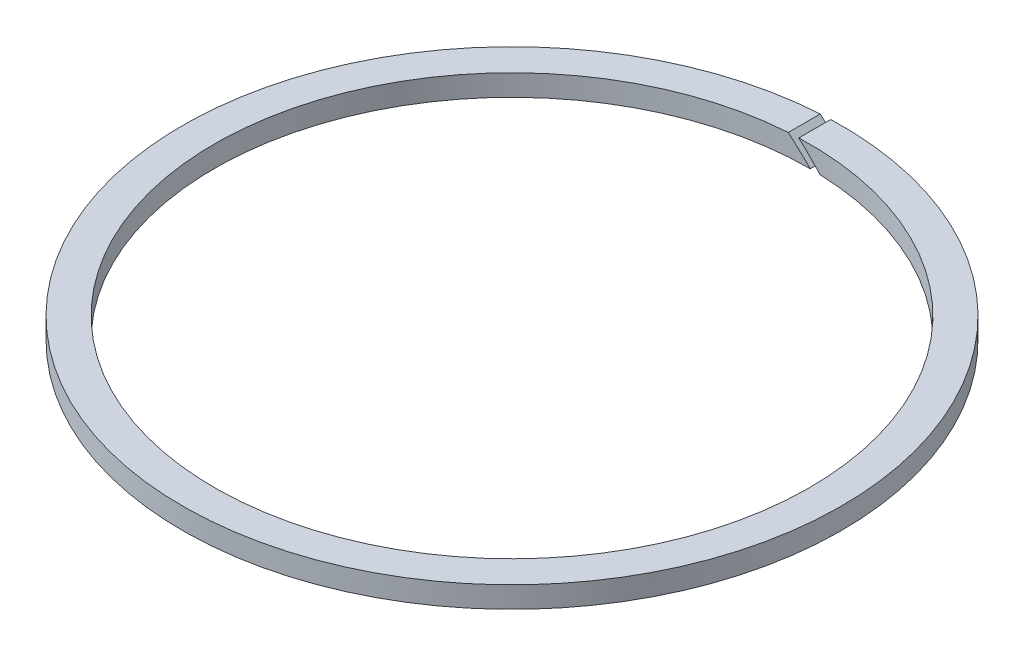
ISO-10303-21;
HEADER;
FILE_DESCRIPTION(('STEP AP214'),'2;1');
FILE_NAME('part.step','',(''),(''),'','','');
FILE_SCHEMA(('AUTOMOTIVE_DESIGN { 1 0 10303 214 1 1 1 1 }'));
ENDSEC;
DATA;
#1=APPLICATION_CONTEXT('core data for automotive mechanical design processes');
#2=APPLICATION_PROTOCOL_DEFINITION('international standard','automotive_design',2000,#1);
#3=PRODUCT_CONTEXT('',#1,'mechanical');
#4=PRODUCT('Part','Part','',(#3));
#5=PRODUCT_RELATED_PRODUCT_CATEGORY('part','',(#4));
#6=PRODUCT_DEFINITION_FORMATION('','',#4);
#7=PRODUCT_DEFINITION_CONTEXT('part definition',#1,'design');
#8=PRODUCT_DEFINITION('design','',#6,#7);
#9=PRODUCT_DEFINITION_SHAPE('','',#8);
#10=(LENGTH_UNIT() NAMED_UNIT(*) SI_UNIT(.MILLI.,.METRE.));
#11=(NAMED_UNIT(*) PLANE_ANGLE_UNIT() SI_UNIT($,.RADIAN.));
#12=(NAMED_UNIT(*) SI_UNIT($,.STERADIAN.) SOLID_ANGLE_UNIT());
#13=UNCERTAINTY_MEASURE_WITH_UNIT(LENGTH_MEASURE(1.E-05),#10,'distance_accuracy_value','');
#14=(GEOMETRIC_REPRESENTATION_CONTEXT(3) GLOBAL_UNCERTAINTY_ASSIGNED_CONTEXT((#13)) GLOBAL_UNIT_ASSIGNED_CONTEXT((#10,
#11,#12)) REPRESENTATION_CONTEXT('',''));
#15=CARTESIAN_POINT('',(0.,0.,0.));
#16=DIRECTION('',(0.,0.,1.));
#17=DIRECTION('',(1.,0.,0.));
#18=AXIS2_PLACEMENT_3D('',#15,#16,#17);
#19=CARTESIAN_POINT('',(0.,1.5,0.));
#20=DIRECTION('',(0.,1.,0.));
#21=DIRECTION('',(0.,0.,1.00000000000001));
#22=AXIS2_PLACEMENT_3D('',#19,#20,#21);
#23=PLANE('',#22);
#24=CARTESIAN_POINT('',(0.,1.5,0.));
#25=DIRECTION('',(0.,1.,0.));
#26=DIRECTION('',(0.,0.,1.00000000000001));
#27=AXIS2_PLACEMENT_3D('',#24,#25,#26);
#28=CIRCLE('',#27,46.5);
#29=CARTESIAN_POINT('',(-2.91421356237315,1.5,-46.4085914385785));
#30=VERTEX_POINT('',#29);
#31=CARTESIAN_POINT('',(-1.50000000000002,1.5,-46.4758001544893));
#32=VERTEX_POINT('',#31);
#33=EDGE_CURVE('E93',#30,#32,#28,.T.);
#34=ORIENTED_EDGE('',*,*,#33,.T.);
#35=DIRECTION('',(0.,0.,1.00000000000001));
#36=VECTOR('',#35,1.);
#37=CARTESIAN_POINT('',(-1.50000000000002,1.5,-46.5000000000003));
#38=LINE('',#37,#36);
#39=CARTESIAN_POINT('',(-1.50000000000002,1.5,-41.9732057388999));
#40=VERTEX_POINT('',#39);
#41=EDGE_CURVE('E87',#32,#40,#38,.T.);
#42=ORIENTED_EDGE('',*,*,#41,.T.);
#43=CARTESIAN_POINT('',(0.,1.5,0.));
#44=DIRECTION('',(0.,1.,0.));
#45=DIRECTION('',(0.,0.,1.00000000000001));
#46=AXIS2_PLACEMENT_3D('',#43,#44,#45);
#47=CIRCLE('',#46,42.);
#48=CARTESIAN_POINT('',(-2.91421356237315,1.5,-41.8987751528956));
#49=VERTEX_POINT('',#48);
#50=EDGE_CURVE('E95',#49,#40,#47,.T.);
#51=ORIENTED_EDGE('',*,*,#50,.F.);
#52=DIRECTION('',(0.,0.,1.00000000000001));
#53=VECTOR('',#52,1.);
#54=CARTESIAN_POINT('',(-2.91421356237315,1.5,-46.5000000000003));
#55=LINE('',#54,#53);
#56=EDGE_CURVE('E61',#30,#49,#55,.T.);
#57=ORIENTED_EDGE('',*,*,#56,.F.);
#58=EDGE_LOOP('',(#34,#42,#51,#57));
#59=FACE_BOUND('',#58,.T.);
#60=ADVANCED_FACE('F38',(#59),#23,.T.);
#61=CARTESIAN_POINT('',(0.,-1.5,0.));
#62=DIRECTION('',(0.,1.,0.));
#63=DIRECTION('',(0.,0.,1.00000000000001));
#64=AXIS2_PLACEMENT_3D('',#61,#62,#63);
#65=PLANE('',#64);
#66=DIRECTION('',(0.,0.,1.00000000000001));
#67=VECTOR('',#66,1.);
#68=CARTESIAN_POINT('',(1.50000000000002,-1.5,-46.5000000000003));
#69=LINE('',#68,#67);
#70=CARTESIAN_POINT('',(1.50000000000002,-1.5,-46.4758001544893));
#71=VERTEX_POINT('',#70);
#72=CARTESIAN_POINT('',(1.50000000000002,-1.5,-41.9732057388999));
#73=VERTEX_POINT('',#72);
#74=EDGE_CURVE('E54',#71,#73,#69,.T.);
#75=ORIENTED_EDGE('',*,*,#74,.F.);
#76=CARTESIAN_POINT('',(0.,-1.5,0.));
#77=DIRECTION('',(0.,1.,0.));
#78=DIRECTION('',(0.,0.,1.00000000000001));
#79=AXIS2_PLACEMENT_3D('',#76,#77,#78);
#80=CIRCLE('',#79,46.5);
#81=CARTESIAN_POINT('',(0.0857864376269148,-1.5,-46.4999208675364));
#82=VERTEX_POINT('',#81);
#83=EDGE_CURVE('E100',#82,#71,#80,.T.);
#84=ORIENTED_EDGE('',*,*,#83,.F.);
#85=DIRECTION('',(0.,0.,1.00000000000001));
#86=VECTOR('',#85,1.);
#87=CARTESIAN_POINT('',(0.0857864376269148,-1.5,-46.5000000000003));
#88=LINE('',#87,#86);
#89=CARTESIAN_POINT('',(0.0857864376269148,-1.5,-41.9999123890413));
#90=VERTEX_POINT('',#89);
#91=EDGE_CURVE('E80',#82,#90,#88,.T.);
#92=ORIENTED_EDGE('',*,*,#91,.T.);
#93=CARTESIAN_POINT('',(0.,-1.5,0.));
#94=DIRECTION('',(0.,1.,0.));
#95=DIRECTION('',(0.,0.,1.00000000000001));
#96=AXIS2_PLACEMENT_3D('',#93,#94,#95);
#97=CIRCLE('',#96,42.);
#98=EDGE_CURVE('E107',#90,#73,#97,.T.);
#99=ORIENTED_EDGE('',*,*,#98,.T.);
#100=EDGE_LOOP('',(#75,#84,#92,#99));
#101=FACE_BOUND('',#100,.T.);
#102=ADVANCED_FACE('F125',(#101),#65,.F.);
#103=CARTESIAN_POINT('',(0.,1.5,0.));
#104=DIRECTION('',(0.,-1.,0.));
#105=DIRECTION('',(0.,0.,-1.00000000000001));
#106=AXIS2_PLACEMENT_3D('',#103,#104,#105);
#107=CYLINDRICAL_SURFACE('',#106,46.5);
#108=CARTESIAN_POINT('',(0.,0.,0.));
#109=DIRECTION('',(-0.707106781186546,-0.707106781186552,0.));
#110=DIRECTION('',(0.707106781186557,-0.707106781186543,0.));
#111=AXIS2_PLACEMENT_3D('',#108,#109,#110);
#112=ELLIPSE('',#111,65.7609306503485,46.5);
#113=EDGE_CURVE('E86',#32,#71,#112,.T.);
#114=ORIENTED_EDGE('',*,*,#113,.F.);
#115=ORIENTED_EDGE('',*,*,#33,.F.);
#116=CARTESIAN_POINT('',(0.,-1.41421356237309,0.));
#117=DIRECTION('',(-0.707106781186548,-0.707106781186552,0.));
#118=DIRECTION('',(0.707106781186556,-0.707106781186544,0.));
#119=AXIS2_PLACEMENT_3D('',#116,#117,#118);
#120=ELLIPSE('',#119,65.7609306503486,46.5);
#121=EDGE_CURVE('E77',#30,#82,#120,.T.);
#122=ORIENTED_EDGE('',*,*,#121,.T.);
#123=ORIENTED_EDGE('',*,*,#83,.T.);
#124=EDGE_LOOP('',(#114,#115,#122,#123));
#125=FACE_BOUND('',#124,.T.);
#126=ADVANCED_FACE('F40',(#125),#107,.T.);
#127=CARTESIAN_POINT('',(0.,1.5,0.));
#128=DIRECTION('',(0.,-1.,0.));
#129=DIRECTION('',(0.,0.,-1.00000000000001));
#130=AXIS2_PLACEMENT_3D('',#127,#128,#129);
#131=CYLINDRICAL_SURFACE('',#130,42.);
#132=ORIENTED_EDGE('',*,*,#50,.T.);
#133=CARTESIAN_POINT('',(0.,0.,0.));
#134=DIRECTION('',(-0.707106781186546,-0.707106781186552,0.));
#135=DIRECTION('',(0.707106781186557,-0.707106781186543,0.));
#136=AXIS2_PLACEMENT_3D('',#133,#134,#135);
#137=ELLIPSE('',#136,59.3969696196696,42.);
#138=EDGE_CURVE('E11',#40,#73,#137,.T.);
#139=ORIENTED_EDGE('',*,*,#138,.T.);
#140=ORIENTED_EDGE('',*,*,#98,.F.);
#141=CARTESIAN_POINT('',(0.,-1.41421356237309,0.));
#142=DIRECTION('',(-0.707106781186548,-0.707106781186552,0.));
#143=DIRECTION('',(0.707106781186556,-0.707106781186544,0.));
#144=AXIS2_PLACEMENT_3D('',#141,#142,#143);
#145=ELLIPSE('',#144,59.3969696196697,42.);
#146=EDGE_CURVE('E47',#49,#90,#145,.T.);
#147=ORIENTED_EDGE('',*,*,#146,.F.);
#148=EDGE_LOOP('',(#132,#139,#140,#147));
#149=FACE_BOUND('',#148,.T.);
#150=ADVANCED_FACE('F122',(#149),#131,.F.);
#151=CARTESIAN_POINT('',(-0.707106781186543,-0.707106781186559,-46.5000000000003));
#152=DIRECTION('',(-0.707106781186548,-0.707106781186552,0.));
#153=DIRECTION('',(0.707106781186556,-0.707106781186544,0.));
#154=AXIS2_PLACEMENT_3D('',#151,#152,#153);
#155=PLANE('',#154);
#156=ORIENTED_EDGE('',*,*,#56,.T.);
#157=ORIENTED_EDGE('',*,*,#146,.T.);
#158=ORIENTED_EDGE('',*,*,#91,.F.);
#159=ORIENTED_EDGE('',*,*,#121,.F.);
#160=EDGE_LOOP('',(#156,#157,#158,#159));
#161=FACE_BOUND('',#160,.T.);
#162=ADVANCED_FACE('F78',(#161),#155,.F.);
#163=CARTESIAN_POINT('',(0.,0.,-46.5000000000003));
#164=DIRECTION('',(-0.707106781186546,-0.707106781186552,0.));
#165=DIRECTION('',(0.707106781186557,-0.707106781186543,0.));
#166=AXIS2_PLACEMENT_3D('',#163,#164,#165);
#167=PLANE('',#166);
#168=ORIENTED_EDGE('',*,*,#113,.T.);
#169=ORIENTED_EDGE('',*,*,#74,.T.);
#170=ORIENTED_EDGE('',*,*,#138,.F.);
#171=ORIENTED_EDGE('',*,*,#41,.F.);
#172=EDGE_LOOP('',(#168,#169,#170,#171));
#173=FACE_BOUND('',#172,.T.);
#174=ADVANCED_FACE('F137',(#173),#167,.T.);
#175=CLOSED_SHELL('',(#60,#102,#126,#150,#162,#174));
#176=MANIFOLD_SOLID_BREP('B2',#175);
#177=ADVANCED_BREP_SHAPE_REPRESENTATION('',(#18,#176),#14);
#178=SHAPE_DEFINITION_REPRESENTATION(#9,#177);
ENDSEC;
END-ISO-10303-21;
